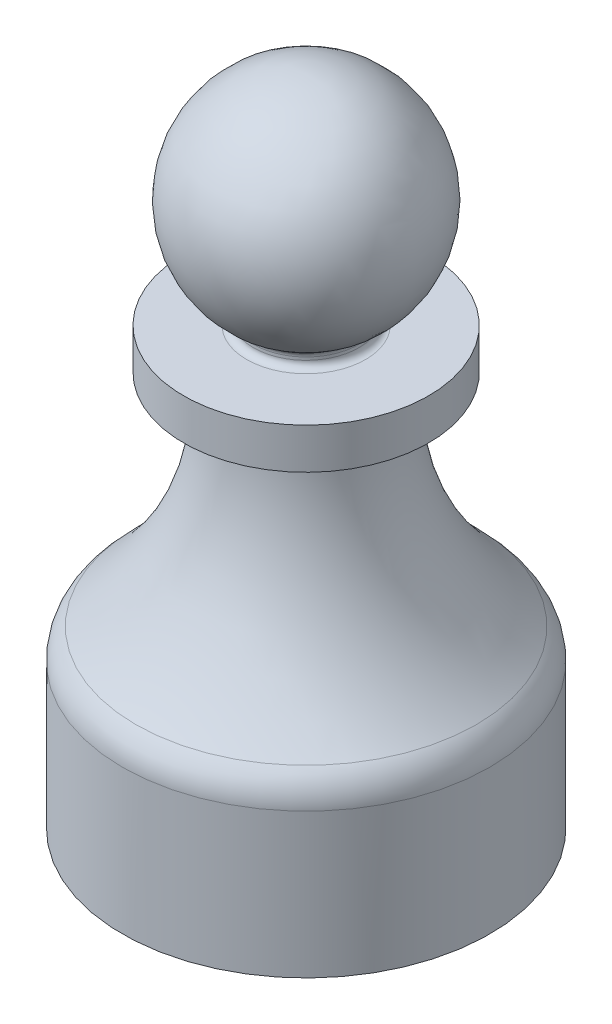
ISO-10303-21;
HEADER;
FILE_DESCRIPTION(('STEP AP214'),'2;1');
FILE_NAME('part.step','',(''),(''),'','','');
FILE_SCHEMA(('AUTOMOTIVE_DESIGN { 1 0 10303 214 1 1 1 1 }'));
ENDSEC;
DATA;
#1=APPLICATION_CONTEXT('core data for automotive mechanical design processes');
#2=APPLICATION_PROTOCOL_DEFINITION('international standard','automotive_design',2000,#1);
#3=PRODUCT_CONTEXT('',#1,'mechanical');
#4=PRODUCT('Part','Part','',(#3));
#5=PRODUCT_RELATED_PRODUCT_CATEGORY('part','',(#4));
#6=PRODUCT_DEFINITION_FORMATION('','',#4);
#7=PRODUCT_DEFINITION_CONTEXT('part definition',#1,'design');
#8=PRODUCT_DEFINITION('design','',#6,#7);
#9=PRODUCT_DEFINITION_SHAPE('','',#8);
#10=(LENGTH_UNIT() NAMED_UNIT(*) SI_UNIT(.MILLI.,.METRE.));
#11=(NAMED_UNIT(*) PLANE_ANGLE_UNIT() SI_UNIT($,.RADIAN.));
#12=(NAMED_UNIT(*) SI_UNIT($,.STERADIAN.) SOLID_ANGLE_UNIT());
#13=UNCERTAINTY_MEASURE_WITH_UNIT(LENGTH_MEASURE(1.E-05),#10,'distance_accuracy_value','');
#14=(GEOMETRIC_REPRESENTATION_CONTEXT(3) GLOBAL_UNCERTAINTY_ASSIGNED_CONTEXT((#13)) GLOBAL_UNIT_ASSIGNED_CONTEXT((#10,
#11,#12)) REPRESENTATION_CONTEXT('',''));
#15=CARTESIAN_POINT('',(0.,0.,0.));
#16=DIRECTION('',(0.,0.,1.));
#17=DIRECTION('',(1.,0.,0.));
#18=AXIS2_PLACEMENT_3D('',#15,#16,#17);
#19=CARTESIAN_POINT('',(0.,27.6489626202674,0.));
#20=DIRECTION('',(0.,-1.,0.));
#21=DIRECTION('',(0.,0.,-1.));
#22=AXIS2_PLACEMENT_3D('',#19,#20,#21);
#23=TOROIDAL_SURFACE('',#22,25.9543152726062,22.);
#24=CARTESIAN_POINT('',(0.,27.6489626202674,0.));
#25=DIRECTION('',(0.,-1.,0.));
#26=DIRECTION('',(0.,0.,-1.));
#27=AXIS2_PLACEMENT_3D('',#24,#25,#26);
#28=CIRCLE('',#27,3.95431527260621);
#29=CARTESIAN_POINT('',(0.,27.6489626202674,-3.95431527260621));
#30=VERTEX_POINT('',#29);
#31=EDGE_CURVE('E123',#30,#30,#28,.T.);
#32=ORIENTED_EDGE('',*,*,#31,.F.);
#33=EDGE_LOOP('',(#32));
#34=FACE_BOUND('',#33,.T.);
#35=CARTESIAN_POINT('',(0.,13.0456921335005,0.));
#36=DIRECTION('',(0.,-1.,0.));
#37=DIRECTION('',(0.,0.,-1.));
#38=AXIS2_PLACEMENT_3D('',#35,#36,#37);
#39=CIRCLE('',#38,9.5);
#40=CARTESIAN_POINT('',(0.,13.0456921335005,-9.5));
#41=VERTEX_POINT('',#40);
#42=EDGE_CURVE('E108',#41,#41,#39,.T.);
#43=ORIENTED_EDGE('',*,*,#42,.T.);
#44=EDGE_LOOP('',(#43));
#45=FACE_BOUND('',#44,.T.);
#46=ADVANCED_FACE('F34',(#34,#45),#23,.T.);
#47=CARTESIAN_POINT('',(0.,37.,0.));
#48=DIRECTION('',(0.,-1.,0.));
#49=DIRECTION('',(0.,0.,-1.));
#50=AXIS2_PLACEMENT_3D('',#47,#48,#49);
#51=CYLINDRICAL_SURFACE('',#50,9.5);
#52=ORIENTED_EDGE('',*,*,#42,.F.);
#53=EDGE_LOOP('',(#52));
#54=FACE_BOUND('',#53,.T.);
#55=CARTESIAN_POINT('',(0.,0.,0.));
#56=DIRECTION('',(0.,-1.,0.));
#57=DIRECTION('',(0.,0.,-1.));
#58=AXIS2_PLACEMENT_3D('',#55,#56,#57);
#59=CIRCLE('',#58,9.5);
#60=CARTESIAN_POINT('',(0.,0.,-9.5));
#61=VERTEX_POINT('',#60);
#62=EDGE_CURVE('E111',#61,#61,#59,.T.);
#63=ORIENTED_EDGE('',*,*,#62,.T.);
#64=EDGE_LOOP('',(#63));
#65=FACE_BOUND('',#64,.T.);
#66=ADVANCED_FACE('F62',(#54,#65),#51,.F.);
#67=CARTESIAN_POINT('',(0.,0.,0.));
#68=DIRECTION('',(0.,-1.,0.));
#69=DIRECTION('',(0.,0.,-1.));
#70=AXIS2_PLACEMENT_3D('',#67,#68,#69);
#71=PLANE('',#70);
#72=CARTESIAN_POINT('',(0.,0.,0.));
#73=DIRECTION('',(0.,-1.,0.));
#74=DIRECTION('',(0.,0.,-1.));
#75=AXIS2_PLACEMENT_3D('',#72,#73,#74);
#76=CIRCLE('',#75,13.5);
#77=CARTESIAN_POINT('',(0.,0.,-13.5));
#78=VERTEX_POINT('',#77);
#79=EDGE_CURVE('E114',#78,#78,#76,.T.);
#80=ORIENTED_EDGE('',*,*,#79,.T.);
#81=EDGE_LOOP('',(#80));
#82=FACE_BOUND('',#81,.T.);
#83=ORIENTED_EDGE('',*,*,#62,.F.);
#84=EDGE_LOOP('',(#83));
#85=FACE_BOUND('',#84,.T.);
#86=ADVANCED_FACE('F68',(#82,#85),#71,.T.);
#87=CARTESIAN_POINT('',(0.,37.,0.));
#88=DIRECTION('',(0.,-1.,0.));
#89=DIRECTION('',(0.,0.,-1.));
#90=AXIS2_PLACEMENT_3D('',#87,#88,#89);
#91=CYLINDRICAL_SURFACE('',#90,13.5);
#92=CARTESIAN_POINT('',(0.,10.6147576357403,0.));
#93=DIRECTION('',(0.,1.,0.));
#94=DIRECTION('',(0.,0.,1.));
#95=AXIS2_PLACEMENT_3D('',#92,#93,#94);
#96=CIRCLE('',#95,13.5);
#97=CARTESIAN_POINT('',(0.,10.6147576357403,13.5));
#98=VERTEX_POINT('',#97);
#99=EDGE_CURVE('E99',#98,#98,#96,.F.);
#100=ORIENTED_EDGE('',*,*,#99,.T.);
#101=EDGE_LOOP('',(#100));
#102=FACE_BOUND('',#101,.T.);
#103=ORIENTED_EDGE('',*,*,#79,.F.);
#104=EDGE_LOOP('',(#103));
#105=FACE_BOUND('',#104,.T.);
#106=ADVANCED_FACE('F147',(#102,#105),#91,.T.);
#107=CARTESIAN_POINT('',(0.,27.6489626202674,0.));
#108=DIRECTION('',(0.,-1.,0.));
#109=DIRECTION('',(0.,0.,-1.));
#110=AXIS2_PLACEMENT_3D('',#107,#108,#109);
#111=TOROIDAL_SURFACE('',#110,25.9543152726062,20.);
#112=CARTESIAN_POINT('',(0.,12.836610459809,0.));
#113=DIRECTION('',(0.,1.,0.));
#114=DIRECTION('',(0.,0.,1.));
#115=AXIS2_PLACEMENT_3D('',#112,#113,#114);
#116=CIRCLE('',#115,12.5157802529486);
#117=CARTESIAN_POINT('',(0.,12.836610459809,12.5157802529486));
#118=VERTEX_POINT('',#117);
#119=EDGE_CURVE('E94',#118,#118,#116,.T.);
#120=ORIENTED_EDGE('',*,*,#119,.T.);
#121=EDGE_LOOP('',(#120));
#122=FACE_BOUND('',#121,.T.);
#123=CARTESIAN_POINT('',(0.,27.8193423808821,0.));
#124=DIRECTION('',(0.,-1.,0.));
#125=DIRECTION('',(0.,0.,-1.));
#126=AXIS2_PLACEMENT_3D('',#123,#124,#125);
#127=CIRCLE('',#126,5.95504101734452);
#128=CARTESIAN_POINT('',(0.,27.8193423808821,-5.95504101734452));
#129=VERTEX_POINT('',#128);
#130=EDGE_CURVE('E105',#129,#129,#127,.T.);
#131=ORIENTED_EDGE('',*,*,#130,.T.);
#132=EDGE_LOOP('',(#131));
#133=FACE_BOUND('',#132,.T.);
#134=ADVANCED_FACE('F143',(#122,#133),#111,.F.);
#135=CARTESIAN_POINT('',(0.,29.,0.));
#136=DIRECTION('',(0.,-1.,0.));
#137=DIRECTION('',(0.,0.,-1.));
#138=AXIS2_PLACEMENT_3D('',#135,#136,#137);
#139=PLANE('',#138);
#140=CARTESIAN_POINT('',(0.,29.,0.));
#141=DIRECTION('',(0.,-1.,0.));
#142=DIRECTION('',(0.,0.,-1.));
#143=AXIS2_PLACEMENT_3D('',#140,#141,#142);
#144=CIRCLE('',#143,8.);
#145=CARTESIAN_POINT('',(0.,29.,-8.));
#146=VERTEX_POINT('',#145);
#147=EDGE_CURVE('E102',#146,#146,#144,.F.);
#148=ORIENTED_EDGE('',*,*,#147,.T.);
#149=EDGE_LOOP('',(#148));
#150=FACE_BOUND('',#149,.T.);
#151=CARTESIAN_POINT('',(0.,29.,0.));
#152=DIRECTION('',(0.,-1.,0.));
#153=DIRECTION('',(0.,0.,-1.));
#154=AXIS2_PLACEMENT_3D('',#151,#152,#153);
#155=CIRCLE('',#154,9.);
#156=CARTESIAN_POINT('',(0.,29.,-9.));
#157=VERTEX_POINT('',#156);
#158=EDGE_CURVE('E117',#157,#157,#155,.T.);
#159=ORIENTED_EDGE('',*,*,#158,.T.);
#160=EDGE_LOOP('',(#159));
#161=FACE_BOUND('',#160,.T.);
#162=ADVANCED_FACE('F138',(#150,#161),#139,.T.);
#163=CARTESIAN_POINT('',(0.,37.,0.));
#164=DIRECTION('',(0.,-1.,0.));
#165=DIRECTION('',(0.,0.,-1.));
#166=AXIS2_PLACEMENT_3D('',#163,#164,#165);
#167=CYLINDRICAL_SURFACE('',#166,9.);
#168=CARTESIAN_POINT('',(0.,32.,0.));
#169=DIRECTION('',(0.,-1.,0.));
#170=DIRECTION('',(0.,0.,-1.));
#171=AXIS2_PLACEMENT_3D('',#168,#169,#170);
#172=CIRCLE('',#171,9.);
#173=CARTESIAN_POINT('',(0.,32.,-9.));
#174=VERTEX_POINT('',#173);
#175=EDGE_CURVE('E120',#174,#174,#172,.T.);
#176=ORIENTED_EDGE('',*,*,#175,.T.);
#177=EDGE_LOOP('',(#176));
#178=FACE_BOUND('',#177,.T.);
#179=ORIENTED_EDGE('',*,*,#158,.F.);
#180=EDGE_LOOP('',(#179));
#181=FACE_BOUND('',#180,.T.);
#182=ADVANCED_FACE('F126',(#178,#181),#167,.T.);
#183=CARTESIAN_POINT('',(0.,32.,0.));
#184=DIRECTION('',(0.,1.,0.));
#185=DIRECTION('',(0.,0.,1.));
#186=AXIS2_PLACEMENT_3D('',#183,#184,#185);
#187=PLANE('',#186);
#188=CARTESIAN_POINT('',(0.,32.,0.));
#189=DIRECTION('',(0.,1.,0.));
#190=DIRECTION('',(0.,0.,1.));
#191=AXIS2_PLACEMENT_3D('',#188,#189,#190);
#192=CIRCLE('',#191,4.37298334620742);
#193=CARTESIAN_POINT('',(0.,32.,4.37298334620742));
#194=VERTEX_POINT('',#193);
#195=EDGE_CURVE('E11',#194,#194,#192,.F.);
#196=ORIENTED_EDGE('',*,*,#195,.T.);
#197=EDGE_LOOP('',(#196));
#198=FACE_BOUND('',#197,.T.);
#199=ORIENTED_EDGE('',*,*,#175,.F.);
#200=EDGE_LOOP('',(#199));
#201=FACE_BOUND('',#200,.T.);
#202=ADVANCED_FACE('F129',(#198,#201),#187,.T.);
#203=CARTESIAN_POINT('',(0.,37.,0.));
#204=DIRECTION('',(0.,-1.,0.));
#205=DIRECTION('',(0.,0.,-1.));
#206=AXIS2_PLACEMENT_3D('',#203,#204,#205);
#207=CYLINDRICAL_SURFACE('',#206,3.87298334620742);
#208=CARTESIAN_POINT('',(0.,32.7111717914474,0.));
#209=DIRECTION('',(0.,1.,0.));
#210=DIRECTION('',(0.,0.,1.));
#211=AXIS2_PLACEMENT_3D('',#208,#209,#210);
#212=CIRCLE('',#211,3.87298334620742);
#213=CARTESIAN_POINT('',(0.,32.7111717914474,3.87298334620742));
#214=VERTEX_POINT('',#213);
#215=EDGE_CURVE('E89',#214,#214,#212,.F.);
#216=ORIENTED_EDGE('',*,*,#215,.T.);
#217=EDGE_LOOP('',(#216));
#218=FACE_BOUND('',#217,.T.);
#219=CARTESIAN_POINT('',(0.,32.5,0.));
#220=DIRECTION('',(0.,1.,0.));
#221=DIRECTION('',(0.,0.,1.));
#222=AXIS2_PLACEMENT_3D('',#219,#220,#221);
#223=CIRCLE('',#222,3.87298334620742);
#224=CARTESIAN_POINT('',(0.,32.5,3.87298334620742));
#225=VERTEX_POINT('',#224);
#226=EDGE_CURVE('E91',#225,#225,#223,.T.);
#227=ORIENTED_EDGE('',*,*,#226,.T.);
#228=EDGE_LOOP('',(#227));
#229=FACE_BOUND('',#228,.T.);
#230=ADVANCED_FACE('F57',(#218,#229),#207,.T.);
#231=CARTESIAN_POINT('',(0.,40.,0.));
#232=DIRECTION('',(0.,-1.,0.));
#233=DIRECTION('',(1.,0.,0.));
#234=AXIS2_PLACEMENT_3D('',#231,#232,#233);
#235=SPHERICAL_SURFACE('',#234,8.);
#236=CARTESIAN_POINT('',(0.,33.1399263919505,0.));
#237=DIRECTION('',(0.,1.,0.));
#238=DIRECTION('',(0.,0.,1.));
#239=AXIS2_PLACEMENT_3D('',#236,#237,#238);
#240=CIRCLE('',#239,4.11574903172463);
#241=CARTESIAN_POINT('',(0.,33.1399263919505,4.11574903172463));
#242=VERTEX_POINT('',#241);
#243=EDGE_CURVE('E41',#242,#242,#240,.T.);
#244=ORIENTED_EDGE('',*,*,#243,.T.);
#245=EDGE_LOOP('',(#244));
#246=FACE_BOUND('',#245,.T.);
#247=ADVANCED_FACE('F47',(#246),#235,.T.);
#248=CARTESIAN_POINT('',(0.,32.,0.));
#249=DIRECTION('',(0.,-1.,0.));
#250=DIRECTION('',(0.,0.,-1.));
#251=AXIS2_PLACEMENT_3D('',#248,#249,#250);
#252=CONICAL_SURFACE('',#251,0.,0.73766740423172);
#253=ORIENTED_EDGE('',*,*,#31,.T.);
#254=EDGE_LOOP('',(#253));
#255=FACE_BOUND('',#254,.T.);
#256=CARTESIAN_POINT('',(0.,32.,0.));
#257=VERTEX_POINT('',#256);
#258=VERTEX_LOOP('',#257);
#259=FACE_BOUND('',#258,.T.);
#260=ADVANCED_FACE('F44',(#255,#259),#252,.F.);
#261=CARTESIAN_POINT('',(0.,27.8193423808821,0.));
#262=DIRECTION('',(0.,1.,0.));
#263=DIRECTION('',(0.,0.,1.));
#264=AXIS2_PLACEMENT_3D('',#261,#262,#263);
#265=CONICAL_SURFACE('',#264,5.95504101734452,1.04719755119659);
#266=ORIENTED_EDGE('',*,*,#147,.F.);
#267=EDGE_LOOP('',(#266));
#268=FACE_BOUND('',#267,.T.);
#269=ORIENTED_EDGE('',*,*,#130,.F.);
#270=EDGE_LOOP('',(#269));
#271=FACE_BOUND('',#270,.T.);
#272=ADVANCED_FACE('F46',(#268,#271),#265,.T.);
#273=CARTESIAN_POINT('',(0.,10.6147576357403,0.));
#274=DIRECTION('',(0.,1.,0.));
#275=DIRECTION('',(0.,0.,1.));
#276=AXIS2_PLACEMENT_3D('',#273,#274,#275);
#277=TOROIDAL_SURFACE('',#276,10.5,3.);
#278=ORIENTED_EDGE('',*,*,#119,.F.);
#279=EDGE_LOOP('',(#278));
#280=FACE_BOUND('',#279,.T.);
#281=ORIENTED_EDGE('',*,*,#99,.F.);
#282=EDGE_LOOP('',(#281));
#283=FACE_BOUND('',#282,.T.);
#284=ADVANCED_FACE('F54',(#280,#283),#277,.T.);
#285=CARTESIAN_POINT('',(0.,32.7111717914474,0.));
#286=DIRECTION('',(0.,1.,0.));
#287=DIRECTION('',(0.,0.,1.));
#288=AXIS2_PLACEMENT_3D('',#285,#286,#287);
#289=TOROIDAL_SURFACE('',#288,4.37298334620742,0.5);
#290=ORIENTED_EDGE('',*,*,#243,.F.);
#291=EDGE_LOOP('',(#290));
#292=FACE_BOUND('',#291,.T.);
#293=ORIENTED_EDGE('',*,*,#215,.F.);
#294=EDGE_LOOP('',(#293));
#295=FACE_BOUND('',#294,.T.);
#296=ADVANCED_FACE('F76',(#292,#295),#289,.F.);
#297=CARTESIAN_POINT('',(0.,32.5,0.));
#298=DIRECTION('',(0.,1.,0.));
#299=DIRECTION('',(0.,0.,1.));
#300=AXIS2_PLACEMENT_3D('',#297,#298,#299);
#301=TOROIDAL_SURFACE('',#300,4.37298334620742,0.5);
#302=ORIENTED_EDGE('',*,*,#226,.F.);
#303=EDGE_LOOP('',(#302));
#304=FACE_BOUND('',#303,.T.);
#305=ORIENTED_EDGE('',*,*,#195,.F.);
#306=EDGE_LOOP('',(#305));
#307=FACE_BOUND('',#306,.T.);
#308=ADVANCED_FACE('F36',(#304,#307),#301,.F.);
#309=CLOSED_SHELL('',(#46,#66,#86,#106,#134,#162,#182,#202,#230,#247,#260,#272,#284,#296,#308));
#310=MANIFOLD_SOLID_BREP('B2',#309);
#311=ADVANCED_BREP_SHAPE_REPRESENTATION('',(#18,#310),#14);
#312=SHAPE_DEFINITION_REPRESENTATION(#9,#311);
ENDSEC;
END-ISO-10303-21;
